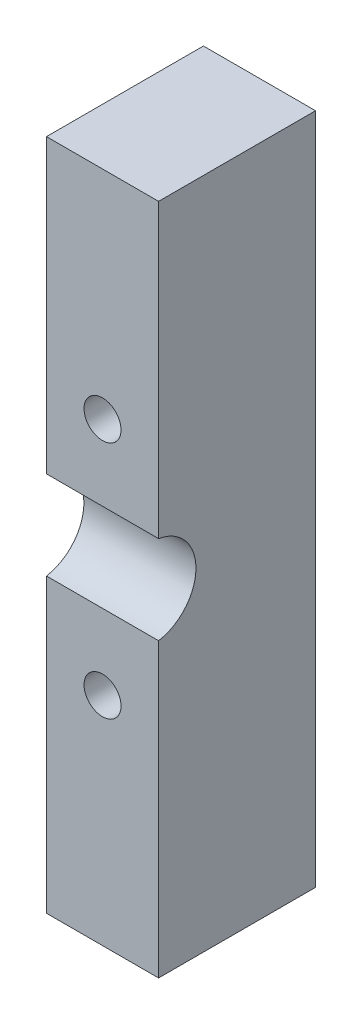
ISO-10303-21;
HEADER;
FILE_DESCRIPTION(('STEP AP214'),'2;1');
FILE_NAME('part.step','',(''),(''),'','','');
FILE_SCHEMA(('AUTOMOTIVE_DESIGN { 1 0 10303 214 1 1 1 1 }'));
ENDSEC;
DATA;
#1=APPLICATION_CONTEXT('core data for automotive mechanical design processes');
#2=APPLICATION_PROTOCOL_DEFINITION('international standard','automotive_design',2000,#1);
#3=PRODUCT_CONTEXT('',#1,'mechanical');
#4=PRODUCT('Part','Part','',(#3));
#5=PRODUCT_RELATED_PRODUCT_CATEGORY('part','',(#4));
#6=PRODUCT_DEFINITION_FORMATION('','',#4);
#7=PRODUCT_DEFINITION_CONTEXT('part definition',#1,'design');
#8=PRODUCT_DEFINITION('design','',#6,#7);
#9=PRODUCT_DEFINITION_SHAPE('','',#8);
#10=(LENGTH_UNIT() NAMED_UNIT(*) SI_UNIT(.MILLI.,.METRE.));
#11=(NAMED_UNIT(*) PLANE_ANGLE_UNIT() SI_UNIT($,.RADIAN.));
#12=(NAMED_UNIT(*) SI_UNIT($,.STERADIAN.) SOLID_ANGLE_UNIT());
#13=UNCERTAINTY_MEASURE_WITH_UNIT(LENGTH_MEASURE(1.E-05),#10,'distance_accuracy_value','');
#14=(GEOMETRIC_REPRESENTATION_CONTEXT(3) GLOBAL_UNCERTAINTY_ASSIGNED_CONTEXT((#13)) GLOBAL_UNIT_ASSIGNED_CONTEXT((#10,
#11,#12)) REPRESENTATION_CONTEXT('',''));
#15=CARTESIAN_POINT('',(0.,0.,0.));
#16=DIRECTION('',(0.,0.,1.));
#17=DIRECTION('',(1.,0.,0.));
#18=AXIS2_PLACEMENT_3D('',#15,#16,#17);
#19=CARTESIAN_POINT('',(55.,0.,22.));
#20=DIRECTION('',(1.,0.,0.));
#21=DIRECTION('',(0.,0.,-1.));
#22=AXIS2_PLACEMENT_3D('',#19,#20,#21);
#23=PLANE('',#22);
#24=CARTESIAN_POINT('',(55.,45.,22.));
#25=DIRECTION('',(-1.,0.,0.));
#26=DIRECTION('',(0.,0.,1.));
#27=AXIS2_PLACEMENT_3D('',#24,#25,#26);
#28=CIRCLE('',#27,6.);
#29=CARTESIAN_POINT('',(55.,50.9160797830996,21.));
#30=VERTEX_POINT('',#29);
#31=CARTESIAN_POINT('',(55.,39.0839202169004,21.));
#32=VERTEX_POINT('',#31);
#33=EDGE_CURVE('E95',#30,#32,#28,.T.);
#34=ORIENTED_EDGE('',*,*,#33,.F.);
#35=DIRECTION('',(0.,1.,0.));
#36=VECTOR('',#35,1.);
#37=CARTESIAN_POINT('',(55.,87.,21.));
#38=LINE('',#37,#36);
#39=CARTESIAN_POINT('',(55.,90.,21.));
#40=VERTEX_POINT('',#39);
#41=EDGE_CURVE('E53',#30,#40,#38,.T.);
#42=ORIENTED_EDGE('',*,*,#41,.T.);
#43=DIRECTION('',(0.,0.,-1.));
#44=VECTOR('',#43,1.);
#45=CARTESIAN_POINT('',(55.,90.,21.));
#46=LINE('',#45,#44);
#47=CARTESIAN_POINT('',(55.,90.,0.));
#48=VERTEX_POINT('',#47);
#49=EDGE_CURVE('E92',#40,#48,#46,.T.);
#50=ORIENTED_EDGE('',*,*,#49,.T.);
#51=DIRECTION('',(0.,-1.,0.));
#52=VECTOR('',#51,1.);
#53=CARTESIAN_POINT('',(55.,90.,0.));
#54=LINE('',#53,#52);
#55=CARTESIAN_POINT('',(55.,0.,0.));
#56=VERTEX_POINT('',#55);
#57=EDGE_CURVE('E108',#48,#56,#54,.T.);
#58=ORIENTED_EDGE('',*,*,#57,.T.);
#59=DIRECTION('',(0.,0.,-1.));
#60=VECTOR('',#59,1.);
#61=CARTESIAN_POINT('',(55.,0.,21.));
#62=LINE('',#61,#60);
#63=CARTESIAN_POINT('',(55.,0.,21.));
#64=VERTEX_POINT('',#63);
#65=EDGE_CURVE('E107',#64,#56,#62,.T.);
#66=ORIENTED_EDGE('',*,*,#65,.F.);
#67=DIRECTION('',(0.,-1.,0.));
#68=VECTOR('',#67,1.);
#69=CARTESIAN_POINT('',(55.,3.,21.));
#70=LINE('',#69,#68);
#71=EDGE_CURVE('E97',#32,#64,#70,.T.);
#72=ORIENTED_EDGE('',*,*,#71,.F.);
#73=EDGE_LOOP('',(#34,#42,#50,#58,#66,#72));
#74=FACE_BOUND('',#73,.T.);
#75=ADVANCED_FACE('F37',(#74),#23,.F.);
#76=CARTESIAN_POINT('',(0.,0.,10.));
#77=DIRECTION('',(0.,1.,0.));
#78=DIRECTION('',(0.,0.,1.));
#79=AXIS2_PLACEMENT_3D('',#76,#77,#78);
#80=PLANE('',#79);
#81=DIRECTION('',(1.,0.,0.));
#82=VECTOR('',#81,1.);
#83=CARTESIAN_POINT('',(55.,0.,21.));
#84=LINE('',#83,#82);
#85=CARTESIAN_POINT('',(70.,0.,21.));
#86=VERTEX_POINT('',#85);
#87=EDGE_CURVE('E113',#64,#86,#84,.T.);
#88=ORIENTED_EDGE('',*,*,#87,.F.);
#89=ORIENTED_EDGE('',*,*,#65,.T.);
#90=DIRECTION('',(1.,0.,0.));
#91=VECTOR('',#90,1.);
#92=CARTESIAN_POINT('',(0.,0.,0.));
#93=LINE('',#92,#91);
#94=CARTESIAN_POINT('',(70.,0.,0.));
#95=VERTEX_POINT('',#94);
#96=EDGE_CURVE('E96',#56,#95,#93,.T.);
#97=ORIENTED_EDGE('',*,*,#96,.T.);
#98=DIRECTION('',(0.,0.,-1.));
#99=VECTOR('',#98,1.);
#100=CARTESIAN_POINT('',(70.,0.,10.));
#101=LINE('',#100,#99);
#102=EDGE_CURVE('E11',#86,#95,#101,.T.);
#103=ORIENTED_EDGE('',*,*,#102,.F.);
#104=EDGE_LOOP('',(#88,#89,#97,#103));
#105=FACE_BOUND('',#104,.T.);
#106=ADVANCED_FACE('F39',(#105),#80,.F.);
#107=CARTESIAN_POINT('',(70.,0.,10.));
#108=DIRECTION('',(-1.,0.,0.));
#109=DIRECTION('',(0.,-1.,0.));
#110=AXIS2_PLACEMENT_3D('',#107,#108,#109);
#111=PLANE('',#110);
#112=DIRECTION('',(0.,1.,0.));
#113=VECTOR('',#112,1.);
#114=CARTESIAN_POINT('',(70.,0.,21.));
#115=LINE('',#114,#113);
#116=CARTESIAN_POINT('',(70.,39.0839202169004,21.));
#117=VERTEX_POINT('',#116);
#118=EDGE_CURVE('E61',#86,#117,#115,.T.);
#119=ORIENTED_EDGE('',*,*,#118,.F.);
#120=ORIENTED_EDGE('',*,*,#102,.T.);
#121=DIRECTION('',(0.,1.,0.));
#122=VECTOR('',#121,1.);
#123=CARTESIAN_POINT('',(70.,0.,0.));
#124=LINE('',#123,#122);
#125=CARTESIAN_POINT('',(70.,90.,0.));
#126=VERTEX_POINT('',#125);
#127=EDGE_CURVE('E140',#95,#126,#124,.T.);
#128=ORIENTED_EDGE('',*,*,#127,.T.);
#129=DIRECTION('',(0.,0.,-1.));
#130=VECTOR('',#129,1.);
#131=CARTESIAN_POINT('',(70.,90.,10.));
#132=LINE('',#131,#130);
#133=CARTESIAN_POINT('',(70.,90.,21.));
#134=VERTEX_POINT('',#133);
#135=EDGE_CURVE('E46',#134,#126,#132,.T.);
#136=ORIENTED_EDGE('',*,*,#135,.F.);
#137=CARTESIAN_POINT('',(70.,50.9160797830996,21.));
#138=VERTEX_POINT('',#137);
#139=EDGE_CURVE('E112',#138,#134,#115,.T.);
#140=ORIENTED_EDGE('',*,*,#139,.F.);
#141=CARTESIAN_POINT('',(70.,45.,22.));
#142=DIRECTION('',(-1.,0.,0.));
#143=DIRECTION('',(0.,-1.,0.));
#144=AXIS2_PLACEMENT_3D('',#141,#142,#143);
#145=CIRCLE('',#144,6.);
#146=EDGE_CURVE('E134',#117,#138,#145,.F.);
#147=ORIENTED_EDGE('',*,*,#146,.F.);
#148=EDGE_LOOP('',(#119,#120,#128,#136,#140,#147));
#149=FACE_BOUND('',#148,.T.);
#150=ADVANCED_FACE('F146',(#149),#111,.F.);
#151=CARTESIAN_POINT('',(70.,90.,10.));
#152=DIRECTION('',(0.,-1.,0.));
#153=DIRECTION('',(1.,0.,0.));
#154=AXIS2_PLACEMENT_3D('',#151,#152,#153);
#155=PLANE('',#154);
#156=DIRECTION('',(-1.,0.,0.));
#157=VECTOR('',#156,1.);
#158=CARTESIAN_POINT('',(70.,90.,0.));
#159=LINE('',#158,#157);
#160=EDGE_CURVE('E106',#126,#48,#159,.T.);
#161=ORIENTED_EDGE('',*,*,#160,.T.);
#162=ORIENTED_EDGE('',*,*,#49,.F.);
#163=DIRECTION('',(-1.,0.,0.));
#164=VECTOR('',#163,1.);
#165=CARTESIAN_POINT('',(70.,90.,21.));
#166=LINE('',#165,#164);
#167=EDGE_CURVE('E103',#134,#40,#166,.T.);
#168=ORIENTED_EDGE('',*,*,#167,.F.);
#169=ORIENTED_EDGE('',*,*,#135,.T.);
#170=EDGE_LOOP('',(#161,#162,#168,#169));
#171=FACE_BOUND('',#170,.T.);
#172=ADVANCED_FACE('F102',(#171),#155,.F.);
#173=CARTESIAN_POINT('',(70.001,45.,22.));
#174=DIRECTION('',(-1.,0.,0.));
#175=DIRECTION('',(0.,0.,1.));
#176=AXIS2_PLACEMENT_3D('',#173,#174,#175);
#177=CYLINDRICAL_SURFACE('',#176,6.);
#178=DIRECTION('',(-1.,0.,0.));
#179=VECTOR('',#178,1.);
#180=CARTESIAN_POINT('',(70.001,50.9160797830996,21.));
#181=LINE('',#180,#179);
#182=EDGE_CURVE('E125',#30,#138,#181,.F.);
#183=ORIENTED_EDGE('',*,*,#182,.F.);
#184=ORIENTED_EDGE('',*,*,#33,.T.);
#185=DIRECTION('',(-1.,0.,0.));
#186=VECTOR('',#185,1.);
#187=CARTESIAN_POINT('',(70.001,39.0839202169004,21.));
#188=LINE('',#187,#186);
#189=EDGE_CURVE('E123',#117,#32,#188,.T.);
#190=ORIENTED_EDGE('',*,*,#189,.F.);
#191=ORIENTED_EDGE('',*,*,#146,.T.);
#192=EDGE_LOOP('',(#183,#184,#190,#191));
#193=FACE_BOUND('',#192,.T.);
#194=ADVANCED_FACE('F157',(#193),#177,.F.);
#195=CARTESIAN_POINT('',(62.5,61.,-7.00035713374685));
#196=DIRECTION('',(0.,0.,1.));
#197=DIRECTION('',(1.,0.,0.));
#198=AXIS2_PLACEMENT_3D('',#195,#196,#197);
#199=CYLINDRICAL_SURFACE('',#198,2.47500000000001);
#200=CARTESIAN_POINT('',(62.5,61.,0.));
#201=DIRECTION('',(0.,0.,1.));
#202=DIRECTION('',(1.,0.,0.));
#203=AXIS2_PLACEMENT_3D('',#200,#201,#202);
#204=CIRCLE('',#203,2.47500000000001);
#205=CARTESIAN_POINT('',(64.975,61.,0.));
#206=VERTEX_POINT('',#205);
#207=EDGE_CURVE('E128',#206,#206,#204,.F.);
#208=CARTESIAN_POINT('',(62.5,61.,21.));
#209=DIRECTION('',(0.,0.,1.));
#210=DIRECTION('',(1.,0.,0.));
#211=AXIS2_PLACEMENT_3D('',#208,#209,#210);
#212=CIRCLE('',#211,2.47500000000001);
#213=CARTESIAN_POINT('',(64.975,61.,21.));
#214=VERTEX_POINT('',#213);
#215=EDGE_CURVE('E120',#214,#214,#212,.F.);
#216=CARTESIAN_POINT('',(64.975,61.,0.));
#217=CARTESIAN_POINT('',(64.975,61.,0.218749999999999));
#218=CARTESIAN_POINT('',(64.975,61.,0.437499999999999));
#219=CARTESIAN_POINT('',(64.975,61.,0.874999999999998));
#220=CARTESIAN_POINT('',(64.975,61.,1.09375));
#221=CARTESIAN_POINT('',(64.975,61.,1.53125));
#222=CARTESIAN_POINT('',(64.975,61.,1.75));
#223=CARTESIAN_POINT('',(64.975,61.,2.1875));
#224=CARTESIAN_POINT('',(64.975,61.,2.40625));
#225=CARTESIAN_POINT('',(64.975,61.,2.84375));
#226=CARTESIAN_POINT('',(64.975,61.,3.0625));
#227=CARTESIAN_POINT('',(64.975,61.,3.5));
#228=CARTESIAN_POINT('',(64.975,61.,3.71875));
#229=CARTESIAN_POINT('',(64.975,61.,4.15625));
#230=CARTESIAN_POINT('',(64.975,61.,4.375));
#231=CARTESIAN_POINT('',(64.975,61.,4.8125));
#232=CARTESIAN_POINT('',(64.975,61.,5.03125));
#233=CARTESIAN_POINT('',(64.975,61.,5.46875));
#234=CARTESIAN_POINT('',(64.975,61.,5.6875));
#235=CARTESIAN_POINT('',(64.975,61.,6.125));
#236=CARTESIAN_POINT('',(64.975,61.,6.34375));
#237=CARTESIAN_POINT('',(64.975,61.,6.78125));
#238=CARTESIAN_POINT('',(64.975,61.,7.));
#239=CARTESIAN_POINT('',(64.975,61.,7.4375));
#240=CARTESIAN_POINT('',(64.975,61.,7.65625));
#241=CARTESIAN_POINT('',(64.975,61.,8.09375));
#242=CARTESIAN_POINT('',(64.975,61.,8.3125));
#243=CARTESIAN_POINT('',(64.975,61.,8.75));
#244=CARTESIAN_POINT('',(64.975,61.,8.96875));
#245=CARTESIAN_POINT('',(64.975,61.,9.40625));
#246=CARTESIAN_POINT('',(64.975,61.,9.625));
#247=CARTESIAN_POINT('',(64.975,61.,10.0625));
#248=CARTESIAN_POINT('',(64.975,61.,10.28125));
#249=CARTESIAN_POINT('',(64.975,61.,10.71875));
#250=CARTESIAN_POINT('',(64.975,61.,10.9375));
#251=CARTESIAN_POINT('',(64.975,61.,11.375));
#252=CARTESIAN_POINT('',(64.975,61.,11.59375));
#253=CARTESIAN_POINT('',(64.975,61.,12.03125));
#254=CARTESIAN_POINT('',(64.975,61.,12.25));
#255=CARTESIAN_POINT('',(64.975,61.,12.6875));
#256=CARTESIAN_POINT('',(64.975,61.,12.90625));
#257=CARTESIAN_POINT('',(64.975,61.,13.34375));
#258=CARTESIAN_POINT('',(64.975,61.,13.5625));
#259=CARTESIAN_POINT('',(64.975,61.,14.));
#260=CARTESIAN_POINT('',(64.975,61.,14.21875));
#261=CARTESIAN_POINT('',(64.975,61.,14.65625));
#262=CARTESIAN_POINT('',(64.975,61.,14.875));
#263=CARTESIAN_POINT('',(64.975,61.,15.3125));
#264=CARTESIAN_POINT('',(64.975,61.,15.53125));
#265=CARTESIAN_POINT('',(64.975,61.,15.96875));
#266=CARTESIAN_POINT('',(64.975,61.,16.1875));
#267=CARTESIAN_POINT('',(64.975,61.,16.625));
#268=CARTESIAN_POINT('',(64.975,61.,16.84375));
#269=CARTESIAN_POINT('',(64.975,61.,17.28125));
#270=CARTESIAN_POINT('',(64.975,61.,17.5));
#271=CARTESIAN_POINT('',(64.975,61.,17.9375));
#272=CARTESIAN_POINT('',(64.975,61.,18.15625));
#273=CARTESIAN_POINT('',(64.975,61.,18.59375));
#274=CARTESIAN_POINT('',(64.975,61.,18.8125));
#275=CARTESIAN_POINT('',(64.975,61.,19.25));
#276=CARTESIAN_POINT('',(64.975,61.,19.46875));
#277=CARTESIAN_POINT('',(64.975,61.,19.90625));
#278=CARTESIAN_POINT('',(64.975,61.,20.125));
#279=CARTESIAN_POINT('',(64.975,61.,20.5625));
#280=CARTESIAN_POINT('',(64.975,61.,20.78125));
#281=CARTESIAN_POINT('',(64.975,61.,21.));
#282=B_SPLINE_CURVE_WITH_KNOTS('',3,(#216,#217,#218,#219,#220,#221,#222,#223,#224,#225,#226,
#227,#228,#229,#230,#231,#232,#233,#234,#235,#236,#237,#238,#239,#240,#241,#242,#243,#244,#245,
#246,#247,#248,#249,#250,#251,#252,#253,#254,#255,#256,#257,#258,#259,#260,#261,#262,#263,#264,
#265,#266,#267,#268,#269,#270,#271,#272,#273,#274,#275,#276,#277,#278,#279,#280,#281),
.UNSPECIFIED.,.F.,.F.,(4,2,2,2,2,2,2,2,2,2,2,2,2,2,2,2,2,2,2,2,2,2,2,2,2,2,2,2,2,2,2,2,4),(0.,
0.65625,1.3125,1.96875,2.625,3.28125,3.9375,4.59375,5.25,5.90625,6.5625,7.21875,7.875,8.53125,
9.1875,9.84375,10.5,11.15625,11.8125,12.46875,13.125,13.78125,14.4375,15.09375,15.75,16.40625,
17.0625,17.71875,18.375,19.03125,19.6875,20.34375,21.),.UNSPECIFIED.);
#283=EDGE_CURVE('BSEAM159',#206,#214,#282,.T.);
#284=ORIENTED_EDGE('',*,*,#207,.T.);
#285=ORIENTED_EDGE('',*,*,#215,.F.);
#286=ORIENTED_EDGE('',*,*,#283,.T.);
#287=ORIENTED_EDGE('',*,*,#283,.F.);
#288=EDGE_LOOP('',(#284,#286,#285,#287));
#289=FACE_BOUND('',#288,.T.);
#290=ADVANCED_FACE('F159',(#289),#199,.F.);
#291=CARTESIAN_POINT('',(62.5,29.,-7.00035713374685));
#292=DIRECTION('',(0.,0.,1.));
#293=DIRECTION('',(1.,0.,0.));
#294=AXIS2_PLACEMENT_3D('',#291,#292,#293);
#295=CYLINDRICAL_SURFACE('',#294,2.47500000000001);
#296=CARTESIAN_POINT('',(62.5,29.,0.));
#297=DIRECTION('',(0.,0.,1.));
#298=DIRECTION('',(1.,0.,0.));
#299=AXIS2_PLACEMENT_3D('',#296,#297,#298);
#300=CIRCLE('',#299,2.47500000000001);
#301=CARTESIAN_POINT('',(64.975,29.,0.));
#302=VERTEX_POINT('',#301);
#303=EDGE_CURVE('E127',#302,#302,#300,.F.);
#304=CARTESIAN_POINT('',(62.5,29.,21.));
#305=DIRECTION('',(0.,0.,1.));
#306=DIRECTION('',(1.,0.,0.));
#307=AXIS2_PLACEMENT_3D('',#304,#305,#306);
#308=CIRCLE('',#307,2.47500000000001);
#309=CARTESIAN_POINT('',(64.975,29.,21.));
#310=VERTEX_POINT('',#309);
#311=EDGE_CURVE('E41',#310,#310,#308,.F.);
#312=CARTESIAN_POINT('',(64.975,29.,0.));
#313=CARTESIAN_POINT('',(64.975,29.,0.218749999999999));
#314=CARTESIAN_POINT('',(64.975,29.,0.437499999999999));
#315=CARTESIAN_POINT('',(64.975,29.,0.874999999999998));
#316=CARTESIAN_POINT('',(64.975,29.,1.09375));
#317=CARTESIAN_POINT('',(64.975,29.,1.53125));
#318=CARTESIAN_POINT('',(64.975,29.,1.75));
#319=CARTESIAN_POINT('',(64.975,29.,2.1875));
#320=CARTESIAN_POINT('',(64.975,29.,2.40625));
#321=CARTESIAN_POINT('',(64.975,29.,2.84375));
#322=CARTESIAN_POINT('',(64.975,29.,3.0625));
#323=CARTESIAN_POINT('',(64.975,29.,3.5));
#324=CARTESIAN_POINT('',(64.975,29.,3.71875));
#325=CARTESIAN_POINT('',(64.975,29.,4.15625));
#326=CARTESIAN_POINT('',(64.975,29.,4.375));
#327=CARTESIAN_POINT('',(64.975,29.,4.8125));
#328=CARTESIAN_POINT('',(64.975,29.,5.03125));
#329=CARTESIAN_POINT('',(64.975,29.,5.46875));
#330=CARTESIAN_POINT('',(64.975,29.,5.6875));
#331=CARTESIAN_POINT('',(64.975,29.,6.125));
#332=CARTESIAN_POINT('',(64.975,29.,6.34375));
#333=CARTESIAN_POINT('',(64.975,29.,6.78125));
#334=CARTESIAN_POINT('',(64.975,29.,7.));
#335=CARTESIAN_POINT('',(64.975,29.,7.4375));
#336=CARTESIAN_POINT('',(64.975,29.,7.65625));
#337=CARTESIAN_POINT('',(64.975,29.,8.09375));
#338=CARTESIAN_POINT('',(64.975,29.,8.3125));
#339=CARTESIAN_POINT('',(64.975,29.,8.75));
#340=CARTESIAN_POINT('',(64.975,29.,8.96875));
#341=CARTESIAN_POINT('',(64.975,29.,9.40625));
#342=CARTESIAN_POINT('',(64.975,29.,9.625));
#343=CARTESIAN_POINT('',(64.975,29.,10.0625));
#344=CARTESIAN_POINT('',(64.975,29.,10.28125));
#345=CARTESIAN_POINT('',(64.975,29.,10.71875));
#346=CARTESIAN_POINT('',(64.975,29.,10.9375));
#347=CARTESIAN_POINT('',(64.975,29.,11.375));
#348=CARTESIAN_POINT('',(64.975,29.,11.59375));
#349=CARTESIAN_POINT('',(64.975,29.,12.03125));
#350=CARTESIAN_POINT('',(64.975,29.,12.25));
#351=CARTESIAN_POINT('',(64.975,29.,12.6875));
#352=CARTESIAN_POINT('',(64.975,29.,12.90625));
#353=CARTESIAN_POINT('',(64.975,29.,13.34375));
#354=CARTESIAN_POINT('',(64.975,29.,13.5625));
#355=CARTESIAN_POINT('',(64.975,29.,14.));
#356=CARTESIAN_POINT('',(64.975,29.,14.21875));
#357=CARTESIAN_POINT('',(64.975,29.,14.65625));
#358=CARTESIAN_POINT('',(64.975,29.,14.875));
#359=CARTESIAN_POINT('',(64.975,29.,15.3125));
#360=CARTESIAN_POINT('',(64.975,29.,15.53125));
#361=CARTESIAN_POINT('',(64.975,29.,15.96875));
#362=CARTESIAN_POINT('',(64.975,29.,16.1875));
#363=CARTESIAN_POINT('',(64.975,29.,16.625));
#364=CARTESIAN_POINT('',(64.975,29.,16.84375));
#365=CARTESIAN_POINT('',(64.975,29.,17.28125));
#366=CARTESIAN_POINT('',(64.975,29.,17.5));
#367=CARTESIAN_POINT('',(64.975,29.,17.9375));
#368=CARTESIAN_POINT('',(64.975,29.,18.15625));
#369=CARTESIAN_POINT('',(64.975,29.,18.59375));
#370=CARTESIAN_POINT('',(64.975,29.,18.8125));
#371=CARTESIAN_POINT('',(64.975,29.,19.25));
#372=CARTESIAN_POINT('',(64.975,29.,19.46875));
#373=CARTESIAN_POINT('',(64.975,29.,19.90625));
#374=CARTESIAN_POINT('',(64.975,29.,20.125));
#375=CARTESIAN_POINT('',(64.975,29.,20.5625));
#376=CARTESIAN_POINT('',(64.975,29.,20.78125));
#377=CARTESIAN_POINT('',(64.975,29.,21.));
#378=B_SPLINE_CURVE_WITH_KNOTS('',3,(#312,#313,#314,#315,#316,#317,#318,#319,#320,#321,#322,
#323,#324,#325,#326,#327,#328,#329,#330,#331,#332,#333,#334,#335,#336,#337,#338,#339,#340,#341,
#342,#343,#344,#345,#346,#347,#348,#349,#350,#351,#352,#353,#354,#355,#356,#357,#358,#359,#360,
#361,#362,#363,#364,#365,#366,#367,#368,#369,#370,#371,#372,#373,#374,#375,#376,#377),
.UNSPECIFIED.,.F.,.F.,(4,2,2,2,2,2,2,2,2,2,2,2,2,2,2,2,2,2,2,2,2,2,2,2,2,2,2,2,2,2,2,2,4),(0.,
0.65625,1.3125,1.96875,2.625,3.28125,3.9375,4.59375,5.25,5.90625,6.5625,7.21875,7.875,8.53125,
9.1875,9.84375,10.5,11.15625,11.8125,12.46875,13.125,13.78125,14.4375,15.09375,15.75,16.40625,
17.0625,17.71875,18.375,19.03125,19.6875,20.34375,21.),.UNSPECIFIED.);
#379=EDGE_CURVE('BSEAM165',#302,#310,#378,.T.);
#380=ORIENTED_EDGE('',*,*,#303,.T.);
#381=ORIENTED_EDGE('',*,*,#311,.F.);
#382=ORIENTED_EDGE('',*,*,#379,.T.);
#383=ORIENTED_EDGE('',*,*,#379,.F.);
#384=EDGE_LOOP('',(#380,#382,#381,#383));
#385=FACE_BOUND('',#384,.T.);
#386=ADVANCED_FACE('F165',(#385),#295,.F.);
#387=CARTESIAN_POINT('',(0.,0.,0.));
#388=DIRECTION('',(0.,0.,1.));
#389=DIRECTION('',(1.,0.,0.));
#390=AXIS2_PLACEMENT_3D('',#387,#388,#389);
#391=PLANE('',#390);
#392=ORIENTED_EDGE('',*,*,#207,.F.);
#393=EDGE_LOOP('',(#392));
#394=FACE_BOUND('',#393,.T.);
#395=ORIENTED_EDGE('',*,*,#303,.F.);
#396=EDGE_LOOP('',(#395));
#397=FACE_BOUND('',#396,.T.);
#398=ORIENTED_EDGE('',*,*,#96,.F.);
#399=ORIENTED_EDGE('',*,*,#57,.F.);
#400=ORIENTED_EDGE('',*,*,#160,.F.);
#401=ORIENTED_EDGE('',*,*,#127,.F.);
#402=EDGE_LOOP('',(#398,#399,#400,#401));
#403=FACE_BOUND('',#402,.T.);
#404=ADVANCED_FACE('F150',(#394,#397,#403),#391,.F.);
#405=CARTESIAN_POINT('',(0.,0.,21.));
#406=DIRECTION('',(0.,0.,1.));
#407=DIRECTION('',(1.,0.,0.));
#408=AXIS2_PLACEMENT_3D('',#405,#406,#407);
#409=PLANE('',#408);
#410=ORIENTED_EDGE('',*,*,#311,.T.);
#411=EDGE_LOOP('',(#410));
#412=FACE_BOUND('',#411,.T.);
#413=ORIENTED_EDGE('',*,*,#189,.T.);
#414=ORIENTED_EDGE('',*,*,#71,.T.);
#415=ORIENTED_EDGE('',*,*,#87,.T.);
#416=ORIENTED_EDGE('',*,*,#118,.T.);
#417=EDGE_LOOP('',(#413,#414,#415,#416));
#418=FACE_BOUND('',#417,.T.);
#419=ADVANCED_FACE('F154',(#412,#418),#409,.T.);
#420=ORIENTED_EDGE('',*,*,#215,.T.);
#421=EDGE_LOOP('',(#420));
#422=FACE_BOUND('',#421,.T.);
#423=ORIENTED_EDGE('',*,*,#182,.T.);
#424=ORIENTED_EDGE('',*,*,#139,.T.);
#425=ORIENTED_EDGE('',*,*,#167,.T.);
#426=ORIENTED_EDGE('',*,*,#41,.F.);
#427=EDGE_LOOP('',(#423,#424,#425,#426));
#428=FACE_BOUND('',#427,.T.);
#429=ADVANCED_FACE('F110',(#422,#428),#409,.T.);
#430=CLOSED_SHELL('',(#75,#106,#150,#172,#194,#290,#386,#404,#419,#429));
#431=MANIFOLD_SOLID_BREP('B2',#430);
#432=ADVANCED_BREP_SHAPE_REPRESENTATION('',(#18,#431),#14);
#433=SHAPE_DEFINITION_REPRESENTATION(#9,#432);
ENDSEC;
END-ISO-10303-21;
